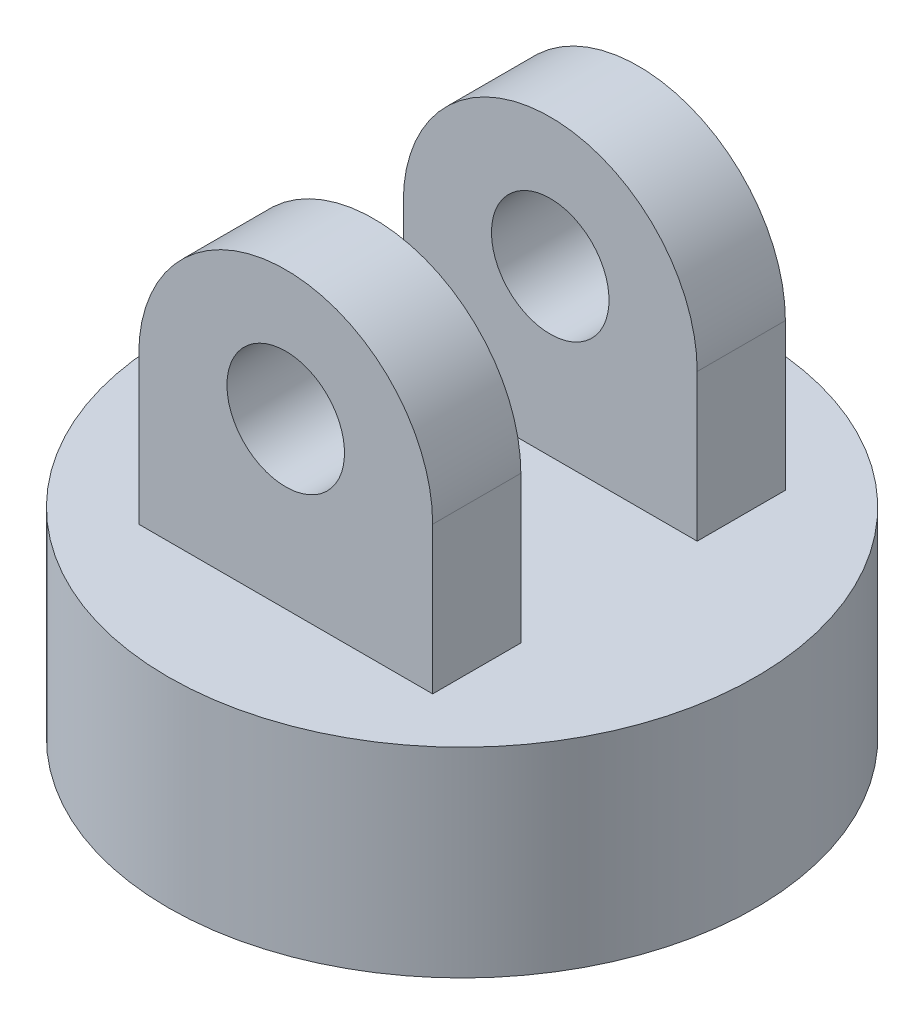
ISO-10303-21;
HEADER;
FILE_DESCRIPTION(('STEP AP214'),'2;1');
FILE_NAME('part.step','',(''),(''),'','','');
FILE_SCHEMA(('AUTOMOTIVE_DESIGN { 1 0 10303 214 1 1 1 1 }'));
ENDSEC;
DATA;
#1=APPLICATION_CONTEXT('core data for automotive mechanical design processes');
#2=APPLICATION_PROTOCOL_DEFINITION('international standard','automotive_design',2000,#1);
#3=PRODUCT_CONTEXT('',#1,'mechanical');
#4=PRODUCT('Part','Part','',(#3));
#5=PRODUCT_RELATED_PRODUCT_CATEGORY('part','',(#4));
#6=PRODUCT_DEFINITION_FORMATION('','',#4);
#7=PRODUCT_DEFINITION_CONTEXT('part definition',#1,'design');
#8=PRODUCT_DEFINITION('design','',#6,#7);
#9=PRODUCT_DEFINITION_SHAPE('','',#8);
#10=(LENGTH_UNIT() NAMED_UNIT(*) SI_UNIT(.MILLI.,.METRE.));
#11=(NAMED_UNIT(*) PLANE_ANGLE_UNIT() SI_UNIT($,.RADIAN.));
#12=(NAMED_UNIT(*) SI_UNIT($,.STERADIAN.) SOLID_ANGLE_UNIT());
#13=UNCERTAINTY_MEASURE_WITH_UNIT(LENGTH_MEASURE(1.E-05),#10,'distance_accuracy_value','');
#14=(GEOMETRIC_REPRESENTATION_CONTEXT(3) GLOBAL_UNCERTAINTY_ASSIGNED_CONTEXT((#13)) GLOBAL_UNIT_ASSIGNED_CONTEXT((#10,
#11,#12)) REPRESENTATION_CONTEXT('',''));
#15=CARTESIAN_POINT('',(0.,0.,0.));
#16=DIRECTION('',(0.,0.,1.));
#17=DIRECTION('',(1.,0.,0.));
#18=AXIS2_PLACEMENT_3D('',#15,#16,#17);
#19=CARTESIAN_POINT('',(0.,59.,15.));
#20=DIRECTION('',(0.,0.,-1.));
#21=DIRECTION('',(-1.,0.,0.));
#22=AXIS2_PLACEMENT_3D('',#19,#20,#21);
#23=CYLINDRICAL_SURFACE('',#22,25.);
#24=DIRECTION('',(0.,0.,1.));
#25=VECTOR('',#24,1.);
#26=CARTESIAN_POINT('',(25.,59.,15.));
#27=LINE('',#26,#25);
#28=CARTESIAN_POINT('',(25.,59.,15.));
#29=VERTEX_POINT('',#28);
#30=CARTESIAN_POINT('',(25.,59.,30.));
#31=VERTEX_POINT('',#30);
#32=EDGE_CURVE('E170',#29,#31,#27,.T.);
#33=ORIENTED_EDGE('',*,*,#32,.F.);
#34=CARTESIAN_POINT('',(0.,59.,15.));
#35=DIRECTION('',(0.,0.,1.));
#36=DIRECTION('',(1.,0.,0.));
#37=AXIS2_PLACEMENT_3D('',#34,#35,#36);
#38=CIRCLE('',#37,25.);
#39=CARTESIAN_POINT('',(-25.,59.,15.));
#40=VERTEX_POINT('',#39);
#41=EDGE_CURVE('E46',#40,#29,#38,.F.);
#42=ORIENTED_EDGE('',*,*,#41,.F.);
#43=DIRECTION('',(0.,0.,1.));
#44=VECTOR('',#43,1.);
#45=CARTESIAN_POINT('',(-25.,59.,15.));
#46=LINE('',#45,#44);
#47=CARTESIAN_POINT('',(-25.,59.,30.));
#48=VERTEX_POINT('',#47);
#49=EDGE_CURVE('E107',#48,#40,#46,.F.);
#50=ORIENTED_EDGE('',*,*,#49,.F.);
#51=CARTESIAN_POINT('',(0.,59.,30.));
#52=DIRECTION('',(0.,0.,-1.));
#53=DIRECTION('',(-1.,0.,0.));
#54=AXIS2_PLACEMENT_3D('',#51,#52,#53);
#55=CIRCLE('',#54,25.);
#56=EDGE_CURVE('E11',#31,#48,#55,.F.);
#57=ORIENTED_EDGE('',*,*,#56,.F.);
#58=EDGE_LOOP('',(#33,#42,#50,#57));
#59=FACE_BOUND('',#58,.T.);
#60=ADVANCED_FACE('F38',(#59),#23,.T.);
#61=CARTESIAN_POINT('',(0.,59.,-30.));
#62=DIRECTION('',(0.,0.,-1.));
#63=DIRECTION('',(-1.,0.,0.));
#64=AXIS2_PLACEMENT_3D('',#61,#62,#63);
#65=CYLINDRICAL_SURFACE('',#64,25.);
#66=DIRECTION('',(0.,0.,-1.));
#67=VECTOR('',#66,1.);
#68=CARTESIAN_POINT('',(25.,59.,-30.));
#69=LINE('',#68,#67);
#70=CARTESIAN_POINT('',(25.,59.,-30.));
#71=VERTEX_POINT('',#70);
#72=CARTESIAN_POINT('',(25.,59.,-15.));
#73=VERTEX_POINT('',#72);
#74=EDGE_CURVE('E158',#71,#73,#69,.F.);
#75=ORIENTED_EDGE('',*,*,#74,.F.);
#76=CARTESIAN_POINT('',(0.,59.,-30.));
#77=DIRECTION('',(0.,0.,1.));
#78=DIRECTION('',(1.,0.,0.));
#79=AXIS2_PLACEMENT_3D('',#76,#77,#78);
#80=CIRCLE('',#79,25.);
#81=CARTESIAN_POINT('',(-25.,59.,-30.));
#82=VERTEX_POINT('',#81);
#83=EDGE_CURVE('E166',#82,#71,#80,.F.);
#84=ORIENTED_EDGE('',*,*,#83,.F.);
#85=DIRECTION('',(0.,0.,-1.));
#86=VECTOR('',#85,1.);
#87=CARTESIAN_POINT('',(-25.,59.,-15.));
#88=LINE('',#87,#86);
#89=CARTESIAN_POINT('',(-25.,59.,-15.));
#90=VERTEX_POINT('',#89);
#91=EDGE_CURVE('E163',#90,#82,#88,.T.);
#92=ORIENTED_EDGE('',*,*,#91,.F.);
#93=CARTESIAN_POINT('',(0.,59.,-15.));
#94=DIRECTION('',(0.,0.,-1.));
#95=DIRECTION('',(-1.,0.,0.));
#96=AXIS2_PLACEMENT_3D('',#93,#94,#95);
#97=CIRCLE('',#96,25.);
#98=EDGE_CURVE('E168',#73,#90,#97,.F.);
#99=ORIENTED_EDGE('',*,*,#98,.F.);
#100=EDGE_LOOP('',(#75,#84,#92,#99));
#101=FACE_BOUND('',#100,.T.);
#102=ADVANCED_FACE('F188',(#101),#65,.T.);
#103=CARTESIAN_POINT('',(0.,34.,0.));
#104=DIRECTION('',(0.,1.,0.));
#105=DIRECTION('',(0.,0.,1.));
#106=AXIS2_PLACEMENT_3D('',#103,#104,#105);
#107=PLANE('',#106);
#108=CARTESIAN_POINT('',(0.,34.,0.));
#109=DIRECTION('',(0.,1.,0.));
#110=DIRECTION('',(0.,0.,1.));
#111=AXIS2_PLACEMENT_3D('',#108,#109,#110);
#112=CIRCLE('',#111,50.);
#113=CARTESIAN_POINT('',(0.,34.,50.));
#114=VERTEX_POINT('',#113);
#115=EDGE_CURVE('E155',#114,#114,#112,.T.);
#116=ORIENTED_EDGE('',*,*,#115,.T.);
#117=EDGE_LOOP('',(#116));
#118=FACE_BOUND('',#117,.T.);
#119=DIRECTION('',(1.,0.,0.));
#120=VECTOR('',#119,1.);
#121=CARTESIAN_POINT('',(25.,34.,-15.));
#122=LINE('',#121,#120);
#123=CARTESIAN_POINT('',(-25.,34.,-15.));
#124=VERTEX_POINT('',#123);
#125=CARTESIAN_POINT('',(25.,34.,-15.));
#126=VERTEX_POINT('',#125);
#127=EDGE_CURVE('E137',#124,#126,#122,.T.);
#128=ORIENTED_EDGE('',*,*,#127,.F.);
#129=DIRECTION('',(0.,0.,1.));
#130=VECTOR('',#129,1.);
#131=CARTESIAN_POINT('',(-25.,34.,-15.));
#132=LINE('',#131,#130);
#133=CARTESIAN_POINT('',(-25.,34.,-30.));
#134=VERTEX_POINT('',#133);
#135=EDGE_CURVE('E109',#134,#124,#132,.T.);
#136=ORIENTED_EDGE('',*,*,#135,.F.);
#137=DIRECTION('',(-1.,0.,0.));
#138=VECTOR('',#137,1.);
#139=CARTESIAN_POINT('',(-25.,34.,-30.));
#140=LINE('',#139,#138);
#141=CARTESIAN_POINT('',(25.,34.,-30.));
#142=VERTEX_POINT('',#141);
#143=EDGE_CURVE('E143',#142,#134,#140,.T.);
#144=ORIENTED_EDGE('',*,*,#143,.F.);
#145=DIRECTION('',(0.,0.,-1.));
#146=VECTOR('',#145,1.);
#147=CARTESIAN_POINT('',(25.,34.,-30.));
#148=LINE('',#147,#146);
#149=EDGE_CURVE('E140',#126,#142,#148,.T.);
#150=ORIENTED_EDGE('',*,*,#149,.F.);
#151=EDGE_LOOP('',(#128,#136,#144,#150));
#152=FACE_BOUND('',#151,.T.);
#153=DIRECTION('',(0.,0.,1.));
#154=VECTOR('',#153,1.);
#155=CARTESIAN_POINT('',(-25.,34.,15.));
#156=LINE('',#155,#154);
#157=CARTESIAN_POINT('',(-25.,34.,15.));
#158=VERTEX_POINT('',#157);
#159=CARTESIAN_POINT('',(-25.,34.,30.));
#160=VERTEX_POINT('',#159);
#161=EDGE_CURVE('E105',#158,#160,#156,.T.);
#162=ORIENTED_EDGE('',*,*,#161,.F.);
#163=DIRECTION('',(-1.,0.,0.));
#164=VECTOR('',#163,1.);
#165=CARTESIAN_POINT('',(25.,34.,15.));
#166=LINE('',#165,#164);
#167=CARTESIAN_POINT('',(25.,34.,15.));
#168=VERTEX_POINT('',#167);
#169=EDGE_CURVE('E113',#168,#158,#166,.T.);
#170=ORIENTED_EDGE('',*,*,#169,.F.);
#171=DIRECTION('',(0.,0.,-1.));
#172=VECTOR('',#171,1.);
#173=CARTESIAN_POINT('',(25.,34.,30.));
#174=LINE('',#173,#172);
#175=CARTESIAN_POINT('',(25.,34.,30.));
#176=VERTEX_POINT('',#175);
#177=EDGE_CURVE('E126',#176,#168,#174,.T.);
#178=ORIENTED_EDGE('',*,*,#177,.F.);
#179=DIRECTION('',(1.,0.,0.));
#180=VECTOR('',#179,1.);
#181=CARTESIAN_POINT('',(-25.,34.,30.));
#182=LINE('',#181,#180);
#183=EDGE_CURVE('E124',#160,#176,#182,.T.);
#184=ORIENTED_EDGE('',*,*,#183,.F.);
#185=EDGE_LOOP('',(#162,#170,#178,#184));
#186=FACE_BOUND('',#185,.T.);
#187=ADVANCED_FACE('F122',(#118,#152,#186),#107,.T.);
#188=CARTESIAN_POINT('',(0.,34.,0.));
#189=DIRECTION('',(0.,-1.,0.));
#190=DIRECTION('',(0.,0.,-1.));
#191=AXIS2_PLACEMENT_3D('',#188,#189,#190);
#192=CYLINDRICAL_SURFACE('',#191,50.);
#193=ORIENTED_EDGE('',*,*,#115,.F.);
#194=EDGE_LOOP('',(#193));
#195=FACE_BOUND('',#194,.T.);
#196=CARTESIAN_POINT('',(0.,0.,0.));
#197=DIRECTION('',(0.,1.,0.));
#198=DIRECTION('',(0.,0.,1.));
#199=AXIS2_PLACEMENT_3D('',#196,#197,#198);
#200=CIRCLE('',#199,50.);
#201=CARTESIAN_POINT('',(0.,0.,50.));
#202=VERTEX_POINT('',#201);
#203=EDGE_CURVE('E154',#202,#202,#200,.T.);
#204=ORIENTED_EDGE('',*,*,#203,.T.);
#205=EDGE_LOOP('',(#204));
#206=FACE_BOUND('',#205,.T.);
#207=ADVANCED_FACE('F196',(#195,#206),#192,.T.);
#208=CARTESIAN_POINT('',(0.,0.,0.));
#209=DIRECTION('',(0.,1.,0.));
#210=DIRECTION('',(0.,0.,1.));
#211=AXIS2_PLACEMENT_3D('',#208,#209,#210);
#212=PLANE('',#211);
#213=ORIENTED_EDGE('',*,*,#203,.F.);
#214=EDGE_LOOP('',(#213));
#215=FACE_BOUND('',#214,.T.);
#216=ADVANCED_FACE('F206',(#215),#212,.F.);
#217=CARTESIAN_POINT('',(-25.,84.,-15.));
#218=DIRECTION('',(1.,0.,0.));
#219=DIRECTION('',(0.,0.,-1.));
#220=AXIS2_PLACEMENT_3D('',#217,#218,#219);
#221=PLANE('',#220);
#222=DIRECTION('',(0.,-1.,0.));
#223=VECTOR('',#222,1.);
#224=CARTESIAN_POINT('',(-25.,84.,-15.));
#225=LINE('',#224,#223);
#226=EDGE_CURVE('E152',#90,#124,#225,.T.);
#227=ORIENTED_EDGE('',*,*,#226,.F.);
#228=ORIENTED_EDGE('',*,*,#91,.T.);
#229=DIRECTION('',(0.,-1.,0.));
#230=VECTOR('',#229,1.);
#231=CARTESIAN_POINT('',(-25.,84.,-30.));
#232=LINE('',#231,#230);
#233=EDGE_CURVE('E146',#82,#134,#232,.T.);
#234=ORIENTED_EDGE('',*,*,#233,.T.);
#235=ORIENTED_EDGE('',*,*,#135,.T.);
#236=EDGE_LOOP('',(#227,#228,#234,#235));
#237=FACE_BOUND('',#236,.T.);
#238=ADVANCED_FACE('F209',(#237),#221,.F.);
#239=CARTESIAN_POINT('',(25.,84.,-15.));
#240=DIRECTION('',(0.,0.,-1.));
#241=DIRECTION('',(-1.,0.,0.));
#242=AXIS2_PLACEMENT_3D('',#239,#240,#241);
#243=PLANE('',#242);
#244=CARTESIAN_POINT('',(0.,62.,-15.));
#245=DIRECTION('',(0.,0.,-1.));
#246=DIRECTION('',(-1.,0.,0.));
#247=AXIS2_PLACEMENT_3D('',#244,#245,#246);
#248=CIRCLE('',#247,10.);
#249=CARTESIAN_POINT('',(-9.99999999999999,62.,-15.));
#250=VERTEX_POINT('',#249);
#251=EDGE_CURVE('E120',#250,#250,#248,.T.);
#252=ORIENTED_EDGE('',*,*,#251,.T.);
#253=EDGE_LOOP('',(#252));
#254=FACE_BOUND('',#253,.T.);
#255=DIRECTION('',(0.,-1.,0.));
#256=VECTOR('',#255,1.);
#257=CARTESIAN_POINT('',(25.,84.,-15.));
#258=LINE('',#257,#256);
#259=EDGE_CURVE('E150',#73,#126,#258,.T.);
#260=ORIENTED_EDGE('',*,*,#259,.F.);
#261=ORIENTED_EDGE('',*,*,#98,.T.);
#262=ORIENTED_EDGE('',*,*,#226,.T.);
#263=ORIENTED_EDGE('',*,*,#127,.T.);
#264=EDGE_LOOP('',(#260,#261,#262,#263));
#265=FACE_BOUND('',#264,.T.);
#266=ADVANCED_FACE('F214',(#254,#265),#243,.F.);
#267=CARTESIAN_POINT('',(25.,84.,-30.));
#268=DIRECTION('',(-1.,0.,0.));
#269=DIRECTION('',(0.,0.,1.));
#270=AXIS2_PLACEMENT_3D('',#267,#268,#269);
#271=PLANE('',#270);
#272=DIRECTION('',(0.,-1.,0.));
#273=VECTOR('',#272,1.);
#274=CARTESIAN_POINT('',(25.,84.,-30.));
#275=LINE('',#274,#273);
#276=EDGE_CURVE('E148',#71,#142,#275,.T.);
#277=ORIENTED_EDGE('',*,*,#276,.F.);
#278=ORIENTED_EDGE('',*,*,#74,.T.);
#279=ORIENTED_EDGE('',*,*,#259,.T.);
#280=ORIENTED_EDGE('',*,*,#149,.T.);
#281=EDGE_LOOP('',(#277,#278,#279,#280));
#282=FACE_BOUND('',#281,.T.);
#283=ADVANCED_FACE('F218',(#282),#271,.F.);
#284=CARTESIAN_POINT('',(-25.,84.,-30.));
#285=DIRECTION('',(0.,0.,1.));
#286=DIRECTION('',(1.,0.,0.));
#287=AXIS2_PLACEMENT_3D('',#284,#285,#286);
#288=PLANE('',#287);
#289=CARTESIAN_POINT('',(0.,62.,-30.));
#290=DIRECTION('',(0.,0.,-1.));
#291=DIRECTION('',(-1.,0.,0.));
#292=AXIS2_PLACEMENT_3D('',#289,#290,#291);
#293=CIRCLE('',#292,10.);
#294=CARTESIAN_POINT('',(-9.99999999999999,62.,-30.));
#295=VERTEX_POINT('',#294);
#296=EDGE_CURVE('E238',#295,#295,#293,.T.);
#297=ORIENTED_EDGE('',*,*,#296,.F.);
#298=EDGE_LOOP('',(#297));
#299=FACE_BOUND('',#298,.T.);
#300=ORIENTED_EDGE('',*,*,#233,.F.);
#301=ORIENTED_EDGE('',*,*,#83,.T.);
#302=ORIENTED_EDGE('',*,*,#276,.T.);
#303=ORIENTED_EDGE('',*,*,#143,.T.);
#304=EDGE_LOOP('',(#300,#301,#302,#303));
#305=FACE_BOUND('',#304,.T.);
#306=ADVANCED_FACE('F222',(#299,#305),#288,.F.);
#307=CARTESIAN_POINT('',(25.,84.,15.));
#308=DIRECTION('',(0.,0.,1.));
#309=DIRECTION('',(1.,0.,0.));
#310=AXIS2_PLACEMENT_3D('',#307,#308,#309);
#311=PLANE('',#310);
#312=CARTESIAN_POINT('',(0.,62.,15.));
#313=DIRECTION('',(0.,0.,1.));
#314=DIRECTION('',(1.,0.,0.));
#315=AXIS2_PLACEMENT_3D('',#312,#313,#314);
#316=CIRCLE('',#315,10.);
#317=CARTESIAN_POINT('',(10.,62.,15.));
#318=VERTEX_POINT('',#317);
#319=EDGE_CURVE('E233',#318,#318,#316,.T.);
#320=ORIENTED_EDGE('',*,*,#319,.T.);
#321=EDGE_LOOP('',(#320));
#322=FACE_BOUND('',#321,.T.);
#323=DIRECTION('',(0.,-1.,0.));
#324=VECTOR('',#323,1.);
#325=CARTESIAN_POINT('',(-25.,84.,15.));
#326=LINE('',#325,#324);
#327=EDGE_CURVE('E100',#40,#158,#326,.T.);
#328=ORIENTED_EDGE('',*,*,#327,.F.);
#329=ORIENTED_EDGE('',*,*,#41,.T.);
#330=DIRECTION('',(0.,-1.,0.));
#331=VECTOR('',#330,1.);
#332=CARTESIAN_POINT('',(25.,84.,15.));
#333=LINE('',#332,#331);
#334=EDGE_CURVE('E116',#29,#168,#333,.T.);
#335=ORIENTED_EDGE('',*,*,#334,.T.);
#336=ORIENTED_EDGE('',*,*,#169,.T.);
#337=EDGE_LOOP('',(#328,#329,#335,#336));
#338=FACE_BOUND('',#337,.T.);
#339=ADVANCED_FACE('F114',(#322,#338),#311,.F.);
#340=CARTESIAN_POINT('',(-25.,84.,15.));
#341=DIRECTION('',(1.,0.,0.));
#342=DIRECTION('',(0.,0.,-1.));
#343=AXIS2_PLACEMENT_3D('',#340,#341,#342);
#344=PLANE('',#343);
#345=DIRECTION('',(0.,-1.,0.));
#346=VECTOR('',#345,1.);
#347=CARTESIAN_POINT('',(-25.,84.,30.));
#348=LINE('',#347,#346);
#349=EDGE_CURVE('E110',#48,#160,#348,.T.);
#350=ORIENTED_EDGE('',*,*,#349,.F.);
#351=ORIENTED_EDGE('',*,*,#49,.T.);
#352=ORIENTED_EDGE('',*,*,#327,.T.);
#353=ORIENTED_EDGE('',*,*,#161,.T.);
#354=EDGE_LOOP('',(#350,#351,#352,#353));
#355=FACE_BOUND('',#354,.T.);
#356=ADVANCED_FACE('F103',(#355),#344,.F.);
#357=CARTESIAN_POINT('',(-25.,84.,30.));
#358=DIRECTION('',(0.,0.,-1.));
#359=DIRECTION('',(-1.,0.,0.));
#360=AXIS2_PLACEMENT_3D('',#357,#358,#359);
#361=PLANE('',#360);
#362=CARTESIAN_POINT('',(0.,62.,30.));
#363=DIRECTION('',(0.,0.,-1.));
#364=DIRECTION('',(-1.,0.,0.));
#365=AXIS2_PLACEMENT_3D('',#362,#363,#364);
#366=CIRCLE('',#365,10.);
#367=CARTESIAN_POINT('',(-9.99999999999999,62.,30.));
#368=VERTEX_POINT('',#367);
#369=EDGE_CURVE('E235',#368,#368,#366,.T.);
#370=ORIENTED_EDGE('',*,*,#369,.T.);
#371=EDGE_LOOP('',(#370));
#372=FACE_BOUND('',#371,.T.);
#373=DIRECTION('',(0.,-1.,0.));
#374=VECTOR('',#373,1.);
#375=CARTESIAN_POINT('',(25.,84.,30.));
#376=LINE('',#375,#374);
#377=EDGE_CURVE('E132',#31,#176,#376,.T.);
#378=ORIENTED_EDGE('',*,*,#377,.F.);
#379=ORIENTED_EDGE('',*,*,#56,.T.);
#380=ORIENTED_EDGE('',*,*,#349,.T.);
#381=ORIENTED_EDGE('',*,*,#183,.T.);
#382=EDGE_LOOP('',(#378,#379,#380,#381));
#383=FACE_BOUND('',#382,.T.);
#384=ADVANCED_FACE('F175',(#372,#383),#361,.F.);
#385=CARTESIAN_POINT('',(25.,84.,30.));
#386=DIRECTION('',(-1.,0.,0.));
#387=DIRECTION('',(0.,0.,1.));
#388=AXIS2_PLACEMENT_3D('',#385,#386,#387);
#389=PLANE('',#388);
#390=ORIENTED_EDGE('',*,*,#334,.F.);
#391=ORIENTED_EDGE('',*,*,#32,.T.);
#392=ORIENTED_EDGE('',*,*,#377,.T.);
#393=ORIENTED_EDGE('',*,*,#177,.T.);
#394=EDGE_LOOP('',(#390,#391,#392,#393));
#395=FACE_BOUND('',#394,.T.);
#396=ADVANCED_FACE('F174',(#395),#389,.F.);
#397=CARTESIAN_POINT('',(0.,62.,30.));
#398=DIRECTION('',(0.,0.,-1.));
#399=DIRECTION('',(-1.,0.,0.));
#400=AXIS2_PLACEMENT_3D('',#397,#398,#399);
#401=CYLINDRICAL_SURFACE('',#400,10.);
#402=ORIENTED_EDGE('',*,*,#369,.F.);
#403=EDGE_LOOP('',(#402));
#404=FACE_BOUND('',#403,.T.);
#405=ORIENTED_EDGE('',*,*,#319,.F.);
#406=EDGE_LOOP('',(#405));
#407=FACE_BOUND('',#406,.T.);
#408=ADVANCED_FACE('F183',(#404,#407),#401,.F.);
#409=ORIENTED_EDGE('',*,*,#296,.T.);
#410=EDGE_LOOP('',(#409));
#411=FACE_BOUND('',#410,.T.);
#412=ORIENTED_EDGE('',*,*,#251,.F.);
#413=EDGE_LOOP('',(#412));
#414=FACE_BOUND('',#413,.T.);
#415=ADVANCED_FACE('F244',(#411,#414),#401,.F.);
#416=CLOSED_SHELL('',(#60,#102,#187,#207,#216,#238,#266,#283,#306,#339,#356,#384,#396,#408,#415));
#417=MANIFOLD_SOLID_BREP('B2',#416);
#418=ADVANCED_BREP_SHAPE_REPRESENTATION('',(#18,#417),#14);
#419=SHAPE_DEFINITION_REPRESENTATION(#9,#418);
ENDSEC;
END-ISO-10303-21;
